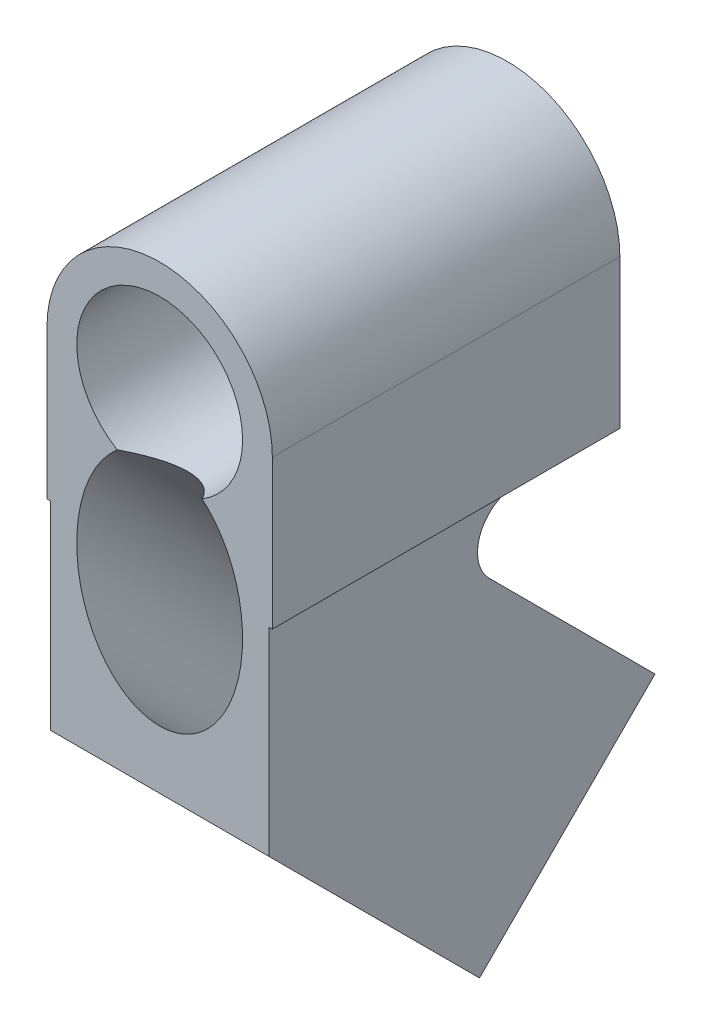
ISO-10303-21;
HEADER;
FILE_DESCRIPTION(('STEP AP214'),'2;1');
FILE_NAME('part.step','',(''),(''),'','','');
FILE_SCHEMA(('AUTOMOTIVE_DESIGN { 1 0 10303 214 1 1 1 1 }'));
ENDSEC;
DATA;
#1=APPLICATION_CONTEXT('core data for automotive mechanical design processes');
#2=APPLICATION_PROTOCOL_DEFINITION('international standard','automotive_design',2000,#1);
#3=PRODUCT_CONTEXT('',#1,'mechanical');
#4=PRODUCT('Part','Part','',(#3));
#5=PRODUCT_RELATED_PRODUCT_CATEGORY('part','',(#4));
#6=PRODUCT_DEFINITION_FORMATION('','',#4);
#7=PRODUCT_DEFINITION_CONTEXT('part definition',#1,'design');
#8=PRODUCT_DEFINITION('design','',#6,#7);
#9=PRODUCT_DEFINITION_SHAPE('','',#8);
#10=(LENGTH_UNIT() NAMED_UNIT(*) SI_UNIT(.MILLI.,.METRE.));
#11=(NAMED_UNIT(*) PLANE_ANGLE_UNIT() SI_UNIT($,.RADIAN.));
#12=(NAMED_UNIT(*) SI_UNIT($,.STERADIAN.) SOLID_ANGLE_UNIT());
#13=UNCERTAINTY_MEASURE_WITH_UNIT(LENGTH_MEASURE(1.E-05),#10,'distance_accuracy_value','');
#14=(GEOMETRIC_REPRESENTATION_CONTEXT(3) GLOBAL_UNCERTAINTY_ASSIGNED_CONTEXT((#13)) GLOBAL_UNIT_ASSIGNED_CONTEXT((#10,
#11,#12)) REPRESENTATION_CONTEXT('',''));
#15=CARTESIAN_POINT('',(0.,0.,0.));
#16=DIRECTION('',(0.,0.,1.));
#17=DIRECTION('',(1.,0.,0.));
#18=AXIS2_PLACEMENT_3D('',#15,#16,#17);
#19=CARTESIAN_POINT('',(-11.35,-15.,-17.5));
#20=DIRECTION('',(0.,-1.,0.));
#21=DIRECTION('',(0.,0.,-1.));
#22=AXIS2_PLACEMENT_3D('',#19,#20,#21);
#23=PLANE('',#22);
#24=DIRECTION('',(1.,0.,0.));
#25=VECTOR('',#24,1.);
#26=CARTESIAN_POINT('',(-11.35,-15.,17.5));
#27=LINE('',#26,#25);
#28=CARTESIAN_POINT('',(11.,-15.,17.5));
#29=VERTEX_POINT('',#28);
#30=CARTESIAN_POINT('',(11.35,-15.,17.5));
#31=VERTEX_POINT('',#30);
#32=EDGE_CURVE('E180',#29,#31,#27,.T.);
#33=ORIENTED_EDGE('',*,*,#32,.F.);
#34=DIRECTION('',(0.,0.,1.));
#35=VECTOR('',#34,1.);
#36=CARTESIAN_POINT('',(11.,-15.,17.5));
#37=LINE('',#36,#35);
#38=CARTESIAN_POINT('',(11.,-15.,-7.51219330881979));
#39=VERTEX_POINT('',#38);
#40=EDGE_CURVE('E64',#39,#29,#37,.T.);
#41=ORIENTED_EDGE('',*,*,#40,.F.);
#42=DIRECTION('',(-1.,0.,0.));
#43=VECTOR('',#42,1.);
#44=CARTESIAN_POINT('',(11.,-15.,-7.51219330881979));
#45=LINE('',#44,#43);
#46=CARTESIAN_POINT('',(-11.,-15.,-7.51219330881979));
#47=VERTEX_POINT('',#46);
#48=EDGE_CURVE('E212',#39,#47,#45,.T.);
#49=ORIENTED_EDGE('',*,*,#48,.T.);
#50=DIRECTION('',(0.,0.,1.));
#51=VECTOR('',#50,1.);
#52=CARTESIAN_POINT('',(-11.,-15.,17.5));
#53=LINE('',#52,#51);
#54=CARTESIAN_POINT('',(-11.,-15.,17.5));
#55=VERTEX_POINT('',#54);
#56=EDGE_CURVE('E136',#47,#55,#53,.T.);
#57=ORIENTED_EDGE('',*,*,#56,.T.);
#58=CARTESIAN_POINT('',(-11.35,-15.,17.5));
#59=VERTEX_POINT('',#58);
#60=EDGE_CURVE('E157',#59,#55,#27,.T.);
#61=ORIENTED_EDGE('',*,*,#60,.F.);
#62=DIRECTION('',(0.,0.,1.));
#63=VECTOR('',#62,1.);
#64=CARTESIAN_POINT('',(-11.35,-15.,-17.5));
#65=LINE('',#64,#63);
#66=CARTESIAN_POINT('',(-11.35,-15.,-17.5));
#67=VERTEX_POINT('',#66);
#68=EDGE_CURVE('E49',#67,#59,#65,.T.);
#69=ORIENTED_EDGE('',*,*,#68,.F.);
#70=DIRECTION('',(1.,0.,0.));
#71=VECTOR('',#70,1.);
#72=CARTESIAN_POINT('',(-11.35,-15.,-17.5));
#73=LINE('',#72,#71);
#74=CARTESIAN_POINT('',(11.35,-15.,-17.5));
#75=VERTEX_POINT('',#74);
#76=EDGE_CURVE('E165',#67,#75,#73,.T.);
#77=ORIENTED_EDGE('',*,*,#76,.T.);
#78=DIRECTION('',(0.,0.,1.));
#79=VECTOR('',#78,1.);
#80=CARTESIAN_POINT('',(11.35,-15.,-17.5));
#81=LINE('',#80,#79);
#82=EDGE_CURVE('E11',#75,#31,#81,.T.);
#83=ORIENTED_EDGE('',*,*,#82,.T.);
#84=EDGE_LOOP('',(#33,#41,#49,#57,#61,#69,#77,#83));
#85=FACE_BOUND('',#84,.T.);
#86=ADVANCED_FACE('F39',(#85),#23,.T.);
#87=CARTESIAN_POINT('',(11.35,-15.,-17.5));
#88=DIRECTION('',(1.,0.,0.));
#89=DIRECTION('',(0.,1.,0.));
#90=AXIS2_PLACEMENT_3D('',#87,#88,#89);
#91=PLANE('',#90);
#92=DIRECTION('',(0.,1.,0.));
#93=VECTOR('',#92,1.);
#94=CARTESIAN_POINT('',(11.35,-15.,17.5));
#95=LINE('',#94,#93);
#96=CARTESIAN_POINT('',(11.35,0.,17.5));
#97=VERTEX_POINT('',#96);
#98=EDGE_CURVE('E146',#31,#97,#95,.T.);
#99=ORIENTED_EDGE('',*,*,#98,.F.);
#100=ORIENTED_EDGE('',*,*,#82,.F.);
#101=DIRECTION('',(0.,1.,0.));
#102=VECTOR('',#101,1.);
#103=CARTESIAN_POINT('',(11.35,-15.,-17.5));
#104=LINE('',#103,#102);
#105=CARTESIAN_POINT('',(11.35,0.,-17.5));
#106=VERTEX_POINT('',#105);
#107=EDGE_CURVE('E152',#75,#106,#104,.T.);
#108=ORIENTED_EDGE('',*,*,#107,.T.);
#109=DIRECTION('',(0.,0.,1.));
#110=VECTOR('',#109,1.);
#111=CARTESIAN_POINT('',(11.35,0.,-17.5));
#112=LINE('',#111,#110);
#113=EDGE_CURVE('E43',#106,#97,#112,.T.);
#114=ORIENTED_EDGE('',*,*,#113,.T.);
#115=EDGE_LOOP('',(#99,#100,#108,#114));
#116=FACE_BOUND('',#115,.T.);
#117=ADVANCED_FACE('F41',(#116),#91,.T.);
#118=CARTESIAN_POINT('',(-11.35,-15.,-17.5));
#119=DIRECTION('',(-1.,0.,0.));
#120=DIRECTION('',(0.,-1.,0.));
#121=AXIS2_PLACEMENT_3D('',#118,#119,#120);
#122=PLANE('',#121);
#123=DIRECTION('',(0.,-1.,0.));
#124=VECTOR('',#123,1.);
#125=CARTESIAN_POINT('',(-11.35,-15.,17.5));
#126=LINE('',#125,#124);
#127=CARTESIAN_POINT('',(-11.35,0.,17.5));
#128=VERTEX_POINT('',#127);
#129=EDGE_CURVE('E176',#128,#59,#126,.T.);
#130=ORIENTED_EDGE('',*,*,#129,.F.);
#131=DIRECTION('',(0.,0.,1.));
#132=VECTOR('',#131,1.);
#133=CARTESIAN_POINT('',(-11.35,0.,-17.5));
#134=LINE('',#133,#132);
#135=CARTESIAN_POINT('',(-11.35,0.,-17.5));
#136=VERTEX_POINT('',#135);
#137=EDGE_CURVE('E185',#136,#128,#134,.T.);
#138=ORIENTED_EDGE('',*,*,#137,.F.);
#139=DIRECTION('',(0.,-1.,0.));
#140=VECTOR('',#139,1.);
#141=CARTESIAN_POINT('',(-11.35,-15.,-17.5));
#142=LINE('',#141,#140);
#143=EDGE_CURVE('E161',#136,#67,#142,.T.);
#144=ORIENTED_EDGE('',*,*,#143,.T.);
#145=ORIENTED_EDGE('',*,*,#68,.T.);
#146=EDGE_LOOP('',(#130,#138,#144,#145));
#147=FACE_BOUND('',#146,.T.);
#148=ADVANCED_FACE('F206',(#147),#122,.T.);
#149=CARTESIAN_POINT('',(0.,0.,-17.5));
#150=DIRECTION('',(0.,0.,1.));
#151=DIRECTION('',(1.,0.,0.));
#152=AXIS2_PLACEMENT_3D('',#149,#150,#151);
#153=CYLINDRICAL_SURFACE('',#152,11.35);
#154=CARTESIAN_POINT('',(0.,0.,17.5));
#155=DIRECTION('',(0.,0.,1.));
#156=DIRECTION('',(1.,0.,0.));
#157=AXIS2_PLACEMENT_3D('',#154,#155,#156);
#158=CIRCLE('',#157,11.35);
#159=EDGE_CURVE('E172',#97,#128,#158,.T.);
#160=ORIENTED_EDGE('',*,*,#159,.F.);
#161=ORIENTED_EDGE('',*,*,#113,.F.);
#162=CARTESIAN_POINT('',(0.,0.,-17.5));
#163=DIRECTION('',(0.,0.,1.));
#164=DIRECTION('',(1.,0.,0.));
#165=AXIS2_PLACEMENT_3D('',#162,#163,#164);
#166=CIRCLE('',#165,11.35);
#167=EDGE_CURVE('E156',#106,#136,#166,.T.);
#168=ORIENTED_EDGE('',*,*,#167,.T.);
#169=ORIENTED_EDGE('',*,*,#137,.T.);
#170=EDGE_LOOP('',(#160,#161,#168,#169));
#171=FACE_BOUND('',#170,.T.);
#172=ADVANCED_FACE('F195',(#171),#153,.T.);
#173=CARTESIAN_POINT('',(0.,0.,-17.5));
#174=DIRECTION('',(0.,0.,1.));
#175=DIRECTION('',(1.,0.,0.));
#176=AXIS2_PLACEMENT_3D('',#173,#174,#175);
#177=PLANE('',#176);
#178=CARTESIAN_POINT('',(0.,0.,-17.5));
#179=DIRECTION('',(0.,0.,1.));
#180=DIRECTION('',(1.,0.,0.));
#181=AXIS2_PLACEMENT_3D('',#178,#179,#180);
#182=CIRCLE('',#181,8.35);
#183=CARTESIAN_POINT('',(8.35,0.,-17.5));
#184=VERTEX_POINT('',#183);
#185=EDGE_CURVE('E140',#184,#184,#182,.T.);
#186=ORIENTED_EDGE('',*,*,#185,.T.);
#187=EDGE_LOOP('',(#186));
#188=FACE_BOUND('',#187,.T.);
#189=ORIENTED_EDGE('',*,*,#107,.F.);
#190=ORIENTED_EDGE('',*,*,#76,.F.);
#191=ORIENTED_EDGE('',*,*,#143,.F.);
#192=ORIENTED_EDGE('',*,*,#167,.F.);
#193=EDGE_LOOP('',(#189,#190,#191,#192));
#194=FACE_BOUND('',#193,.T.);
#195=ADVANCED_FACE('F203',(#188,#194),#177,.F.);
#196=CARTESIAN_POINT('',(0.,0.,17.5));
#197=DIRECTION('',(0.,0.,1.));
#198=DIRECTION('',(1.,0.,0.));
#199=AXIS2_PLACEMENT_3D('',#196,#197,#198);
#200=PLANE('',#199);
#201=CARTESIAN_POINT('',(0.,-17.3223304703364,17.5));
#202=DIRECTION('',(0.,0.,1.));
#203=DIRECTION('',(0.,-1.,0.));
#204=AXIS2_PLACEMENT_3D('',#201,#202,#203);
#205=ELLIPSE('',#204,11.8086832458153,8.35);
#206=CARTESIAN_POINT('',(-4.27080853312828,-7.17514421272205,17.5));
#207=VERTEX_POINT('',#206);
#208=CARTESIAN_POINT('',(4.27080853312828,-7.17514421272205,17.5));
#209=VERTEX_POINT('',#208);
#210=EDGE_CURVE('E56',#207,#209,#205,.T.);
#211=ORIENTED_EDGE('',*,*,#210,.F.);
#212=CARTESIAN_POINT('',(0.,0.,17.5));
#213=DIRECTION('',(0.,0.,1.));
#214=DIRECTION('',(1.,0.,0.));
#215=AXIS2_PLACEMENT_3D('',#212,#213,#214);
#216=CIRCLE('',#215,8.35);
#217=EDGE_CURVE('E134',#209,#207,#216,.T.);
#218=ORIENTED_EDGE('',*,*,#217,.F.);
#219=EDGE_LOOP('',(#211,#218));
#220=FACE_BOUND('',#219,.T.);
#221=ORIENTED_EDGE('',*,*,#98,.T.);
#222=ORIENTED_EDGE('',*,*,#159,.T.);
#223=ORIENTED_EDGE('',*,*,#129,.T.);
#224=ORIENTED_EDGE('',*,*,#60,.T.);
#225=DIRECTION('',(0.,-1.,0.));
#226=VECTOR('',#225,1.);
#227=CARTESIAN_POINT('',(-11.,-15.,17.5));
#228=LINE('',#227,#226);
#229=CARTESIAN_POINT('',(-11.,-35.,17.5));
#230=VERTEX_POINT('',#229);
#231=EDGE_CURVE('E216',#55,#230,#228,.T.);
#232=ORIENTED_EDGE('',*,*,#231,.T.);
#233=DIRECTION('',(-1.,0.,0.));
#234=VECTOR('',#233,1.);
#235=CARTESIAN_POINT('',(11.,-35.,17.5));
#236=LINE('',#235,#234);
#237=CARTESIAN_POINT('',(11.,-35.,17.5));
#238=VERTEX_POINT('',#237);
#239=EDGE_CURVE('E141',#238,#230,#236,.T.);
#240=ORIENTED_EDGE('',*,*,#239,.F.);
#241=DIRECTION('',(0.,-1.,0.));
#242=VECTOR('',#241,1.);
#243=CARTESIAN_POINT('',(11.,-15.,17.5));
#244=LINE('',#243,#242);
#245=EDGE_CURVE('E198',#29,#238,#244,.T.);
#246=ORIENTED_EDGE('',*,*,#245,.F.);
#247=ORIENTED_EDGE('',*,*,#32,.T.);
#248=EDGE_LOOP('',(#221,#222,#223,#224,#232,#240,#246,#247));
#249=FACE_BOUND('',#248,.T.);
#250=ADVANCED_FACE('F132',(#220,#249),#200,.T.);
#251=CARTESIAN_POINT('',(0.,0.,-17.5));
#252=DIRECTION('',(0.,0.,1.));
#253=DIRECTION('',(1.,0.,0.));
#254=AXIS2_PLACEMENT_3D('',#251,#252,#253);
#255=CYLINDRICAL_SURFACE('',#254,8.35);
#256=ORIENTED_EDGE('',*,*,#185,.F.);
#257=EDGE_LOOP('',(#256));
#258=FACE_BOUND('',#257,.T.);
#259=ORIENTED_EDGE('',*,*,#217,.T.);
#260=CARTESIAN_POINT('',(0.,0.,34.8223304703364));
#261=DIRECTION('',(0.,-0.923879532511287,0.382683432365089));
#262=DIRECTION('',(0.,0.382683432365089,0.923879532511287));
#263=AXIS2_PLACEMENT_3D('',#260,#261,#262);
#264=ELLIPSE('',#263,21.8196015134356,8.35);
#265=EDGE_CURVE('E122',#207,#209,#264,.T.);
#266=ORIENTED_EDGE('',*,*,#265,.T.);
#267=EDGE_LOOP('',(#259,#266));
#268=FACE_BOUND('',#267,.T.);
#269=ADVANCED_FACE('F138',(#258,#268),#255,.F.);
#270=CARTESIAN_POINT('',(11.,-35.,17.5));
#271=DIRECTION('',(0.,0.707106781186549,-0.707106781186546));
#272=DIRECTION('',(0.,0.707106781186546,0.707106781186549));
#273=AXIS2_PLACEMENT_3D('',#270,#271,#272);
#274=PLANE('',#273);
#275=DIRECTION('',(0.,-0.707106781186546,-0.707106781186549));
#276=VECTOR('',#275,1.);
#277=CARTESIAN_POINT('',(-11.,-35.,17.5));
#278=LINE('',#277,#276);
#279=CARTESIAN_POINT('',(-11.,-56.2132034355964,-3.71320343559647));
#280=VERTEX_POINT('',#279);
#281=EDGE_CURVE('E219',#230,#280,#278,.T.);
#282=ORIENTED_EDGE('',*,*,#281,.T.);
#283=DIRECTION('',(-1.,0.,0.));
#284=VECTOR('',#283,1.);
#285=CARTESIAN_POINT('',(11.,-56.2132034355964,-3.71320343559647));
#286=LINE('',#285,#284);
#287=CARTESIAN_POINT('',(11.,-56.2132034355964,-3.71320343559647));
#288=VERTEX_POINT('',#287);
#289=EDGE_CURVE('E149',#288,#280,#286,.T.);
#290=ORIENTED_EDGE('',*,*,#289,.F.);
#291=DIRECTION('',(0.,-0.707106781186546,-0.707106781186549));
#292=VECTOR('',#291,1.);
#293=CARTESIAN_POINT('',(11.,-35.,17.5));
#294=LINE('',#293,#292);
#295=EDGE_CURVE('E271',#238,#288,#294,.T.);
#296=ORIENTED_EDGE('',*,*,#295,.F.);
#297=ORIENTED_EDGE('',*,*,#239,.T.);
#298=EDGE_LOOP('',(#282,#290,#296,#297));
#299=FACE_BOUND('',#298,.T.);
#300=ADVANCED_FACE('F285',(#299),#274,.F.);
#301=CARTESIAN_POINT('',(11.,-56.2132034355964,-3.71320343559647));
#302=DIRECTION('',(0.,0.707106781186546,0.707106781186549));
#303=DIRECTION('',(0.,-0.707106781186549,0.707106781186546));
#304=AXIS2_PLACEMENT_3D('',#301,#302,#303);
#305=PLANE('',#304);
#306=CARTESIAN_POINT('',(0.,-47.3743686707645,-12.5520382004283));
#307=DIRECTION('',(0.,-0.707106781186546,-0.707106781186549));
#308=DIRECTION('',(0.,0.707106781186549,-0.707106781186546));
#309=AXIS2_PLACEMENT_3D('',#306,#307,#308);
#310=CIRCLE('',#309,8.35);
#311=CARTESIAN_POINT('',(0.,-41.4700270478568,-18.456379823336));
#312=VERTEX_POINT('',#311);
#313=EDGE_CURVE('E129',#312,#312,#310,.T.);
#314=ORIENTED_EDGE('',*,*,#313,.F.);
#315=EDGE_LOOP('',(#314));
#316=FACE_BOUND('',#315,.T.);
#317=DIRECTION('',(0.,0.707106781186549,-0.707106781186546));
#318=VECTOR('',#317,1.);
#319=CARTESIAN_POINT('',(-11.,-56.2132034355964,-3.71320343559647));
#320=LINE('',#319,#318);
#321=CARTESIAN_POINT('',(-11.,-38.5355339059326,-21.3908729652601));
#322=VERTEX_POINT('',#321);
#323=EDGE_CURVE('E227',#280,#322,#320,.T.);
#324=ORIENTED_EDGE('',*,*,#323,.T.);
#325=DIRECTION('',(-1.,0.,0.));
#326=VECTOR('',#325,1.);
#327=CARTESIAN_POINT('',(11.,-38.5355339059326,-21.3908729652601));
#328=LINE('',#327,#326);
#329=CARTESIAN_POINT('',(11.,-38.5355339059326,-21.3908729652601));
#330=VERTEX_POINT('',#329);
#331=EDGE_CURVE('E242',#330,#322,#328,.T.);
#332=ORIENTED_EDGE('',*,*,#331,.F.);
#333=DIRECTION('',(0.,0.707106781186549,-0.707106781186546));
#334=VECTOR('',#333,1.);
#335=CARTESIAN_POINT('',(11.,-56.2132034355964,-3.71320343559647));
#336=LINE('',#335,#334);
#337=EDGE_CURVE('E254',#288,#330,#336,.T.);
#338=ORIENTED_EDGE('',*,*,#337,.F.);
#339=ORIENTED_EDGE('',*,*,#289,.T.);
#340=EDGE_LOOP('',(#324,#332,#338,#339));
#341=FACE_BOUND('',#340,.T.);
#342=ADVANCED_FACE('F252',(#316,#341),#305,.F.);
#343=CARTESIAN_POINT('',(11.,-21.8284271247462,-4.6837661840736));
#344=DIRECTION('',(0.,-0.707106781186549,0.707106781186546));
#345=DIRECTION('',(0.,-0.707106781186546,-0.707106781186549));
#346=AXIS2_PLACEMENT_3D('',#343,#344,#345);
#347=PLANE('',#346);
#348=DIRECTION('',(0.,0.707106781186546,0.707106781186549));
#349=VECTOR('',#348,1.);
#350=CARTESIAN_POINT('',(-11.,-21.8284271247462,-4.6837661840736));
#351=LINE('',#350,#349);
#352=CARTESIAN_POINT('',(-11.,-21.8284271247462,-4.6837661840736));
#353=VERTEX_POINT('',#352);
#354=EDGE_CURVE('E230',#322,#353,#351,.T.);
#355=ORIENTED_EDGE('',*,*,#354,.T.);
#356=DIRECTION('',(-1.,0.,0.));
#357=VECTOR('',#356,1.);
#358=CARTESIAN_POINT('',(11.,-21.8284271247462,-4.6837661840736));
#359=LINE('',#358,#357);
#360=CARTESIAN_POINT('',(11.,-21.8284271247462,-4.6837661840736));
#361=VERTEX_POINT('',#360);
#362=EDGE_CURVE('E238',#361,#353,#359,.T.);
#363=ORIENTED_EDGE('',*,*,#362,.F.);
#364=DIRECTION('',(0.,0.707106781186546,0.707106781186549));
#365=VECTOR('',#364,1.);
#366=CARTESIAN_POINT('',(11.,-21.8284271247462,-4.6837661840736));
#367=LINE('',#366,#365);
#368=EDGE_CURVE('E268',#330,#361,#367,.T.);
#369=ORIENTED_EDGE('',*,*,#368,.F.);
#370=ORIENTED_EDGE('',*,*,#331,.T.);
#371=EDGE_LOOP('',(#355,#363,#369,#370));
#372=FACE_BOUND('',#371,.T.);
#373=ADVANCED_FACE('F262',(#372),#347,.F.);
#374=CARTESIAN_POINT('',(11.,-19.,-7.51219330881979));
#375=DIRECTION('',(-1.,0.,0.));
#376=DIRECTION('',(0.,0.,1.));
#377=AXIS2_PLACEMENT_3D('',#374,#375,#376);
#378=CYLINDRICAL_SURFACE('',#377,4.);
#379=CARTESIAN_POINT('',(-11.,-19.,-7.51219330881979));
#380=DIRECTION('',(-1.,0.,0.));
#381=DIRECTION('',(0.,0.,1.));
#382=AXIS2_PLACEMENT_3D('',#379,#380,#381);
#383=CIRCLE('',#382,4.);
#384=EDGE_CURVE('E233',#353,#47,#383,.T.);
#385=ORIENTED_EDGE('',*,*,#384,.T.);
#386=ORIENTED_EDGE('',*,*,#48,.F.);
#387=CARTESIAN_POINT('',(11.,-19.,-7.51219330881979));
#388=DIRECTION('',(-1.,0.,0.));
#389=DIRECTION('',(0.,0.,1.));
#390=AXIS2_PLACEMENT_3D('',#387,#388,#389);
#391=CIRCLE('',#390,4.);
#392=EDGE_CURVE('E222',#361,#39,#391,.T.);
#393=ORIENTED_EDGE('',*,*,#392,.F.);
#394=ORIENTED_EDGE('',*,*,#362,.T.);
#395=EDGE_LOOP('',(#385,#386,#393,#394));
#396=FACE_BOUND('',#395,.T.);
#397=ADVANCED_FACE('F266',(#396),#378,.F.);
#398=CARTESIAN_POINT('',(11.,-19.,-7.51219330881979));
#399=DIRECTION('',(-1.,0.,0.));
#400=DIRECTION('',(0.,0.,1.));
#401=AXIS2_PLACEMENT_3D('',#398,#399,#400);
#402=PLANE('',#401);
#403=ORIENTED_EDGE('',*,*,#40,.T.);
#404=ORIENTED_EDGE('',*,*,#245,.T.);
#405=ORIENTED_EDGE('',*,*,#295,.T.);
#406=ORIENTED_EDGE('',*,*,#337,.T.);
#407=ORIENTED_EDGE('',*,*,#368,.T.);
#408=ORIENTED_EDGE('',*,*,#392,.T.);
#409=EDGE_LOOP('',(#403,#404,#405,#406,#407,#408));
#410=FACE_BOUND('',#409,.T.);
#411=ADVANCED_FACE('F341',(#410),#402,.F.);
#412=CARTESIAN_POINT('',(-11.,-19.,-7.51219330881979));
#413=DIRECTION('',(-1.,0.,0.));
#414=DIRECTION('',(0.,0.,1.));
#415=AXIS2_PLACEMENT_3D('',#412,#413,#414);
#416=PLANE('',#415);
#417=ORIENTED_EDGE('',*,*,#56,.F.);
#418=ORIENTED_EDGE('',*,*,#384,.F.);
#419=ORIENTED_EDGE('',*,*,#354,.F.);
#420=ORIENTED_EDGE('',*,*,#323,.F.);
#421=ORIENTED_EDGE('',*,*,#281,.F.);
#422=ORIENTED_EDGE('',*,*,#231,.F.);
#423=EDGE_LOOP('',(#417,#418,#419,#420,#421,#422));
#424=FACE_BOUND('',#423,.T.);
#425=ADVANCED_FACE('F259',(#424),#416,.T.);
#426=CARTESIAN_POINT('',(0.,-8.48349570550449,26.3388347648319));
#427=DIRECTION('',(0.,-0.707106781186546,-0.707106781186549));
#428=DIRECTION('',(0.,0.707106781186549,-0.707106781186546));
#429=AXIS2_PLACEMENT_3D('',#426,#427,#428);
#430=CYLINDRICAL_SURFACE('',#429,8.35);
#431=ORIENTED_EDGE('',*,*,#210,.T.);
#432=ORIENTED_EDGE('',*,*,#265,.F.);
#433=EDGE_LOOP('',(#431,#432));
#434=FACE_BOUND('',#433,.T.);
#435=ORIENTED_EDGE('',*,*,#313,.T.);
#436=EDGE_LOOP('',(#435));
#437=FACE_BOUND('',#436,.T.);
#438=ADVANCED_FACE('F123',(#434,#437),#430,.F.);
#439=CLOSED_SHELL('',(#86,#117,#148,#172,#195,#250,#269,#300,#342,#373,#397,#411,#425,#438));
#440=MANIFOLD_SOLID_BREP('B2',#439);
#441=ADVANCED_BREP_SHAPE_REPRESENTATION('',(#18,#440),#14);
#442=SHAPE_DEFINITION_REPRESENTATION(#9,#441);
ENDSEC;
END-ISO-10303-21;
